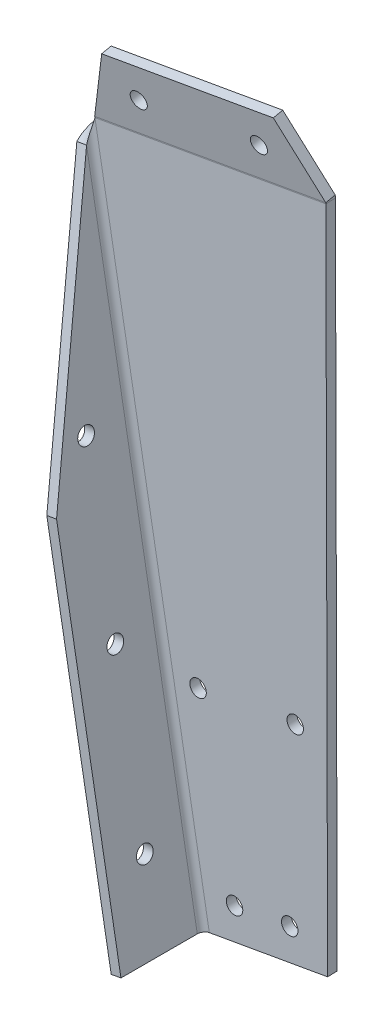
ISO-10303-21;
HEADER;
FILE_DESCRIPTION(('STEP AP214'),'2;1');
FILE_NAME('part.step','',(''),(''),'','','');
FILE_SCHEMA(('AUTOMOTIVE_DESIGN { 1 0 10303 214 1 1 1 1 }'));
ENDSEC;
DATA;
#1=APPLICATION_CONTEXT('core data for automotive mechanical design processes');
#2=APPLICATION_PROTOCOL_DEFINITION('international standard','automotive_design',2000,#1);
#3=PRODUCT_CONTEXT('',#1,'mechanical');
#4=PRODUCT('Part','Part','',(#3));
#5=PRODUCT_RELATED_PRODUCT_CATEGORY('part','',(#4));
#6=PRODUCT_DEFINITION_FORMATION('','',#4);
#7=PRODUCT_DEFINITION_CONTEXT('part definition',#1,'design');
#8=PRODUCT_DEFINITION('design','',#6,#7);
#9=PRODUCT_DEFINITION_SHAPE('','',#8);
#10=(LENGTH_UNIT() NAMED_UNIT(*) SI_UNIT(.MILLI.,.METRE.));
#11=(NAMED_UNIT(*) PLANE_ANGLE_UNIT() SI_UNIT($,.RADIAN.));
#12=(NAMED_UNIT(*) SI_UNIT($,.STERADIAN.) SOLID_ANGLE_UNIT());
#13=UNCERTAINTY_MEASURE_WITH_UNIT(LENGTH_MEASURE(1.E-05),#10,'distance_accuracy_value','');
#14=(GEOMETRIC_REPRESENTATION_CONTEXT(3) GLOBAL_UNCERTAINTY_ASSIGNED_CONTEXT((#13)) GLOBAL_UNIT_ASSIGNED_CONTEXT((#10,
#11,#12)) REPRESENTATION_CONTEXT('',''));
#15=CARTESIAN_POINT('',(0.,0.,0.));
#16=DIRECTION('',(0.,0.,1.));
#17=DIRECTION('',(1.,0.,0.));
#18=AXIS2_PLACEMENT_3D('',#15,#16,#17);
#19=CARTESIAN_POINT('',(40.5229081352837,-118.887426694435,-1.20000000000042));
#20=DIRECTION('',(-0.173648177666925,0.984807753012209,0.));
#21=DIRECTION('',(0.0301395647770479,0.00531441845699562,0.9995315720834));
#22=AXIS2_PLACEMENT_3D('',#19,#20,#21);
#23=PLANE('',#22);
#24=DIRECTION('',(-0.984807753012209,-0.173648177666925,0.));
#25=VECTOR('',#24,1.);
#26=CARTESIAN_POINT('',(40.5229081352837,-118.887426694435,-1.20000000000042));
#27=LINE('',#26,#25);
#28=CARTESIAN_POINT('',(56.058127365598,-116.14814839291,-1.20000000000058));
#29=VERTEX_POINT('',#28);
#30=CARTESIAN_POINT('',(41.7407214026586,-118.672693357932,-1.20000000000046));
#31=VERTEX_POINT('',#30);
#32=EDGE_CURVE('E851',#29,#31,#27,.T.);
#33=ORIENTED_EDGE('',*,*,#32,.F.);
#34=DIRECTION('',(0.0301395647770479,0.00531441845699562,0.9995315720834));
#35=VECTOR('',#34,1.);
#36=CARTESIAN_POINT('',(56.0435765136531,-116.1507141007,-1.6825562687206));
#37=LINE('',#36,#35);
#38=CARTESIAN_POINT('',(56.0943117931264,-116.141768102055,-5.34294830600857E-13));
#39=VERTEX_POINT('',#38);
#40=EDGE_CURVE('E857',#29,#39,#37,.T.);
#41=ORIENTED_EDGE('',*,*,#40,.T.);
#42=DIRECTION('',(-0.984807753012209,-0.173648177666925,0.));
#43=VECTOR('',#42,1.);
#44=CARTESIAN_POINT('',(40.5229081352837,-118.887426694435,-4.23272528138341E-13));
#45=LINE('',#44,#43);
#46=CARTESIAN_POINT('',(41.7407214026586,-118.672693357932,-4.57966997657877E-13));
#47=VERTEX_POINT('',#46);
#48=EDGE_CURVE('E381',#39,#47,#45,.T.);
#49=ORIENTED_EDGE('',*,*,#48,.T.);
#50=DIRECTION('',(0.,0.,-1.));
#51=VECTOR('',#50,1.);
#52=CARTESIAN_POINT('',(41.7407214026586,-118.672693357932,-4.57966997657877E-13));
#53=LINE('',#52,#51);
#54=EDGE_CURVE('E762',#47,#31,#53,.T.);
#55=ORIENTED_EDGE('',*,*,#54,.T.);
#56=EDGE_LOOP('',(#33,#41,#49,#55));
#57=FACE_BOUND('',#56,.T.);
#58=ADVANCED_FACE('F357',(#57),#23,.F.);
#59=CARTESIAN_POINT('',(51.4990755268782,-113.115970141008,7.5709961234934));
#60=DIRECTION('',(0.,0.,-1.));
#61=DIRECTION('',(-0.00259920917379773,0.99999662205013,0.));
#62=AXIS2_PLACEMENT_3D('',#59,#60,#61);
#63=CYLINDRICAL_SURFACE('',#62,1.);
#64=CARTESIAN_POINT('',(51.4990755268782,-113.115970141008,-4.75314232417645E-13));
#65=DIRECTION('',(0.,0.,1.));
#66=DIRECTION('',(0.00259920917379741,-0.99999662205013,0.));
#67=AXIS2_PLACEMENT_3D('',#64,#65,#66);
#68=CIRCLE('',#67,1.);
#69=CARTESIAN_POINT('',(51.501674736052,-114.115966763058,-4.82225370745937E-13));
#70=VERTEX_POINT('',#69);
#71=EDGE_CURVE('E856',#70,#70,#68,.T.);
#72=ORIENTED_EDGE('',*,*,#71,.T.);
#73=EDGE_LOOP('',(#72));
#74=FACE_BOUND('',#73,.T.);
#75=CARTESIAN_POINT('',(51.4990755268782,-113.115970141008,-1.20000000000047));
#76=DIRECTION('',(0.,0.,1.));
#77=DIRECTION('',(0.00259920917379741,-0.99999662205013,0.));
#78=AXIS2_PLACEMENT_3D('',#75,#76,#77);
#79=CIRCLE('',#78,1.);
#80=CARTESIAN_POINT('',(51.5016747360519,-114.115966763058,-1.20000000000048));
#81=VERTEX_POINT('',#80);
#82=EDGE_CURVE('E1230',#81,#81,#79,.T.);
#83=ORIENTED_EDGE('',*,*,#82,.F.);
#84=EDGE_LOOP('',(#83));
#85=FACE_BOUND('',#84,.T.);
#86=ADVANCED_FACE('F898',(#74,#85),#63,.F.);
#87=CARTESIAN_POINT('',(44.8019622447787,-114.296851905503,7.57099612349343));
#88=DIRECTION('',(0.,0.,-1.));
#89=DIRECTION('',(-0.00259920917379773,0.99999662205013,0.));
#90=AXIS2_PLACEMENT_3D('',#87,#88,#89);
#91=CYLINDRICAL_SURFACE('',#90,0.999999999999999);
#92=CARTESIAN_POINT('',(44.8019622447787,-114.296851905503,-4.31946145518225E-13));
#93=DIRECTION('',(0.,0.,1.));
#94=DIRECTION('',(0.00259920917379741,-0.99999662205013,0.));
#95=AXIS2_PLACEMENT_3D('',#92,#93,#94);
#96=CIRCLE('',#95,0.999999999999999);
#97=CARTESIAN_POINT('',(44.8045614539525,-115.296848527553,-4.38857283846517E-13));
#98=VERTEX_POINT('',#97);
#99=EDGE_CURVE('E860',#98,#98,#96,.T.);
#100=ORIENTED_EDGE('',*,*,#99,.T.);
#101=EDGE_LOOP('',(#100));
#102=FACE_BOUND('',#101,.T.);
#103=CARTESIAN_POINT('',(44.8019622447787,-114.296851905503,-1.20000000000042));
#104=DIRECTION('',(0.,0.,1.));
#105=DIRECTION('',(0.00259920917379741,-0.99999662205013,0.));
#106=AXIS2_PLACEMENT_3D('',#103,#104,#105);
#107=CIRCLE('',#106,0.999999999999999);
#108=CARTESIAN_POINT('',(44.8045614539525,-115.296848527553,-1.20000000000043));
#109=VERTEX_POINT('',#108);
#110=EDGE_CURVE('E1232',#109,#109,#107,.T.);
#111=ORIENTED_EDGE('',*,*,#110,.F.);
#112=EDGE_LOOP('',(#111));
#113=FACE_BOUND('',#112,.T.);
#114=ADVANCED_FACE('F894',(#102,#113),#91,.F.);
#115=CARTESIAN_POINT('',(52.1655284743713,-91.5762731472136,-19.7885837374025));
#116=DIRECTION('',(0.,0.,1.));
#117=DIRECTION('',(0.00259920917379774,-0.99999662205013,0.));
#118=AXIS2_PLACEMENT_3D('',#115,#116,#117);
#119=CYLINDRICAL_SURFACE('',#118,0.999999999999999);
#120=CARTESIAN_POINT('',(52.1655284743715,-91.5762731472136,-3.3133218391157E-13));
#121=DIRECTION('',(0.,0.,1.));
#122=DIRECTION('',(0.00259920917379741,-0.99999662205013,0.));
#123=AXIS2_PLACEMENT_3D('',#120,#121,#122);
#124=CIRCLE('',#123,0.999999999999999);
#125=CARTESIAN_POINT('',(52.1681276835453,-92.5762697692637,-3.38243322239862E-13));
#126=VERTEX_POINT('',#125);
#127=EDGE_CURVE('E1222',#126,#126,#124,.T.);
#128=ORIENTED_EDGE('',*,*,#127,.T.);
#129=EDGE_LOOP('',(#128));
#130=FACE_BOUND('',#129,.T.);
#131=CARTESIAN_POINT('',(52.1655284743714,-91.5762731472136,-1.20000000000033));
#132=DIRECTION('',(0.,0.,1.));
#133=DIRECTION('',(0.00259920917379741,-0.99999662205013,0.));
#134=AXIS2_PLACEMENT_3D('',#131,#132,#133);
#135=CIRCLE('',#134,0.999999999999999);
#136=CARTESIAN_POINT('',(52.1681276835452,-92.5762697692637,-1.20000000000033));
#137=VERTEX_POINT('',#136);
#138=EDGE_CURVE('E1235',#137,#137,#135,.T.);
#139=ORIENTED_EDGE('',*,*,#138,.F.);
#140=EDGE_LOOP('',(#139));
#141=FACE_BOUND('',#140,.T.);
#142=ADVANCED_FACE('F890',(#130,#141),#119,.F.);
#143=CARTESIAN_POINT('',(40.3757302963078,-93.6551326631136,-19.7885837374025));
#144=DIRECTION('',(0.,0.,1.));
#145=DIRECTION('',(0.00259920917379774,-0.99999662205013,0.));
#146=AXIS2_PLACEMENT_3D('',#143,#144,#145);
#147=CYLINDRICAL_SURFACE('',#146,1.00000000000001);
#148=CARTESIAN_POINT('',(40.3757302963079,-93.6551326631135,-2.48065457064683E-13));
#149=DIRECTION('',(0.,0.,1.));
#150=DIRECTION('',(0.00259920917379741,-0.99999662205013,0.));
#151=AXIS2_PLACEMENT_3D('',#148,#149,#150);
#152=CIRCLE('',#151,1.00000000000001);
#153=CARTESIAN_POINT('',(40.3783295054817,-94.6551292851637,-2.54976595392975E-13));
#154=VERTEX_POINT('',#153);
#155=EDGE_CURVE('E1218',#154,#154,#152,.T.);
#156=ORIENTED_EDGE('',*,*,#155,.T.);
#157=EDGE_LOOP('',(#156));
#158=FACE_BOUND('',#157,.T.);
#159=CARTESIAN_POINT('',(40.3757302963079,-93.6551326631135,-1.20000000000025));
#160=DIRECTION('',(0.,0.,1.));
#161=DIRECTION('',(0.00259920917379741,-0.99999662205013,0.));
#162=AXIS2_PLACEMENT_3D('',#159,#160,#161);
#163=CIRCLE('',#162,1.00000000000001);
#164=CARTESIAN_POINT('',(40.3783295054817,-94.6551292851637,-1.20000000000025));
#165=VERTEX_POINT('',#164);
#166=EDGE_CURVE('E1240',#165,#165,#163,.T.);
#167=ORIENTED_EDGE('',*,*,#166,.F.);
#168=EDGE_LOOP('',(#167));
#169=FACE_BOUND('',#168,.T.);
#170=ADVANCED_FACE('F886',(#158,#169),#147,.F.);
#171=CARTESIAN_POINT('',(26.7600931125057,-5.01209025732177,-1.19999999999953));
#172=DIRECTION('',(0.,0.,1.));
#173=DIRECTION('',(0.00259920917379741,-0.99999662205013,0.));
#174=AXIS2_PLACEMENT_3D('',#171,#172,#173);
#175=PLANE('',#174);
#176=ORIENTED_EDGE('',*,*,#166,.T.);
#177=EDGE_LOOP('',(#176));
#178=FACE_BOUND('',#177,.T.);
#179=ORIENTED_EDGE('',*,*,#138,.T.);
#180=EDGE_LOOP('',(#179));
#181=FACE_BOUND('',#180,.T.);
#182=ORIENTED_EDGE('',*,*,#110,.T.);
#183=EDGE_LOOP('',(#182));
#184=FACE_BOUND('',#183,.T.);
#185=ORIENTED_EDGE('',*,*,#82,.T.);
#186=EDGE_LOOP('',(#185));
#187=FACE_BOUND('',#186,.T.);
#188=DIRECTION('',(-0.984807753012209,-0.173648177666924,0.));
#189=VECTOR('',#188,1.);
#190=CARTESIAN_POINT('',(26.6422445310609,-40.1662715515746,-1.19999999999989));
#191=LINE('',#190,#189);
#192=CARTESIAN_POINT('',(55.8472488957681,-35.0166413103685,-1.20000000000009));
#193=VERTEX_POINT('',#192);
#194=CARTESIAN_POINT('',(27.8600577984359,-39.9515382150718,-1.1999999999998));
#195=VERTEX_POINT('',#194);
#196=EDGE_CURVE('E848',#193,#195,#191,.T.);
#197=ORIENTED_EDGE('',*,*,#196,.F.);
#198=DIRECTION('',(0.00259920917379741,-0.99999662205013,0.));
#199=VECTOR('',#198,1.);
#200=CARTESIAN_POINT('',(55.769064545279,-4.9366896179517,-1.19999999999977));
#201=LINE('',#200,#199);
#202=EDGE_CURVE('E852',#193,#29,#201,.T.);
#203=ORIENTED_EDGE('',*,*,#202,.T.);
#204=ORIENTED_EDGE('',*,*,#32,.T.);
#205=DIRECTION('',(-0.173648177666924,0.984807753012209,0.));
#206=VECTOR('',#205,1.);
#207=CARTESIAN_POINT('',(41.7407214026586,-118.672693357932,-1.20000000000046));
#208=LINE('',#207,#206);
#209=EDGE_CURVE('E754',#31,#195,#208,.T.);
#210=ORIENTED_EDGE('',*,*,#209,.T.);
#211=EDGE_LOOP('',(#197,#203,#204,#210));
#212=FACE_BOUND('',#211,.T.);
#213=ADVANCED_FACE('F845',(#178,#181,#184,#187,#212),#175,.F.);
#214=CARTESIAN_POINT('',(48.0948388677279,9.29093557071434,-254.361269440302));
#215=DIRECTION('',(-0.999541897699897,-0.00259802724610245,0.0301536896070483));
#216=DIRECTION('',(0.0301536896070484,-0.171010071662835,0.984807753012208));
#217=AXIS2_PLACEMENT_3D('',#214,#215,#216);
#218=PLANE('',#217);
#219=CARTESIAN_POINT('',(55.8834333232966,-35.0102610195137,0.));
#220=CARTESIAN_POINT('',(55.8472488957681,-35.0166413103684,-1.20000000000009));
#221=B_SPLINE_CURVE_WITH_KNOTS('',1,(#219,#220),.UNSPECIFIED.,.F.,.F.,(2,2),(0.,1.),.UNSPECIFIED.);
#222=CARTESIAN_POINT('',(55.8834333232966,-35.0102610195137,0.));
#223=VERTEX_POINT('',#222);
#224=EDGE_CURVE('E763',#223,#193,#221,.T.);
#225=ORIENTED_EDGE('',*,*,#224,.F.);
#226=DIRECTION('',(0.00259920917379741,-0.99999662205013,0.));
#227=VECTOR('',#226,1.);
#228=CARTESIAN_POINT('',(55.805265312004,-4.9365955242689,2.31585584042904E-13));
#229=LINE('',#228,#227);
#230=EDGE_CURVE('E853',#223,#39,#229,.T.);
#231=ORIENTED_EDGE('',*,*,#230,.T.);
#232=ORIENTED_EDGE('',*,*,#40,.F.);
#233=ORIENTED_EDGE('',*,*,#202,.F.);
#234=EDGE_LOOP('',(#225,#231,#232,#233));
#235=FACE_BOUND('',#234,.T.);
#236=ADVANCED_FACE('F875',(#235),#218,.F.);
#237=CARTESIAN_POINT('',(26.7600931125058,-5.01209025732178,4.70110061989715E-13));
#238=DIRECTION('',(0.,0.,1.));
#239=DIRECTION('',(0.00259920917379741,-0.99999662205013,0.));
#240=AXIS2_PLACEMENT_3D('',#237,#238,#239);
#241=PLANE('',#240);
#242=ORIENTED_EDGE('',*,*,#155,.F.);
#243=EDGE_LOOP('',(#242));
#244=FACE_BOUND('',#243,.T.);
#245=ORIENTED_EDGE('',*,*,#127,.F.);
#246=EDGE_LOOP('',(#245));
#247=FACE_BOUND('',#246,.T.);
#248=ORIENTED_EDGE('',*,*,#99,.F.);
#249=EDGE_LOOP('',(#248));
#250=FACE_BOUND('',#249,.T.);
#251=ORIENTED_EDGE('',*,*,#71,.F.);
#252=EDGE_LOOP('',(#251));
#253=FACE_BOUND('',#252,.T.);
#254=ORIENTED_EDGE('',*,*,#230,.F.);
#255=DIRECTION('',(0.984807753012209,0.173648177666924,0.));
#256=VECTOR('',#255,1.);
#257=CARTESIAN_POINT('',(26.6422445310609,-40.1662715515746,1.14406405250876E-13));
#258=LINE('',#257,#256);
#259=CARTESIAN_POINT('',(27.8600577984359,-39.9515382150717,0.));
#260=VERTEX_POINT('',#259);
#261=EDGE_CURVE('E373',#260,#223,#258,.T.);
#262=ORIENTED_EDGE('',*,*,#261,.F.);
#263=DIRECTION('',(-0.173648177666924,0.984807753012209,0.));
#264=VECTOR('',#263,1.);
#265=CARTESIAN_POINT('',(41.7407214026586,-118.672693357932,-4.57966997657877E-13));
#266=LINE('',#265,#264);
#267=EDGE_CURVE('E366',#47,#260,#266,.T.);
#268=ORIENTED_EDGE('',*,*,#267,.F.);
#269=ORIENTED_EDGE('',*,*,#48,.F.);
#270=EDGE_LOOP('',(#254,#262,#268,#269));
#271=FACE_BOUND('',#270,.T.);
#272=ADVANCED_FACE('F359',(#244,#247,#250,#253,#271),#241,.T.);
#273=CARTESIAN_POINT('',(27.8600577984359,-39.9515382150717,0.736600000000106));
#274=DIRECTION('',(-0.984807753012209,-0.173648177666925,0.));
#275=DIRECTION('',(0.173648177666925,-0.984807753012209,0.));
#276=AXIS2_PLACEMENT_3D('',#273,#274,#275);
#277=PLANE('',#276);
#278=CARTESIAN_POINT('',(27.8600577984359,-39.9515382150718,1.95373231481888E-13));
#279=CARTESIAN_POINT('',(27.8600577984359,-39.9515382150718,-1.1999999999998));
#280=B_SPLINE_CURVE_WITH_KNOTS('',1,(#278,#279),.UNSPECIFIED.,.F.,.F.,(2,2),(0.,1.),.UNSPECIFIED.);
#281=EDGE_CURVE('E13',#260,#195,#280,.T.);
#282=ORIENTED_EDGE('',*,*,#281,.F.);
#283=CARTESIAN_POINT('',(27.8600577984359,-39.9515382150717,0.736600000000106));
#284=DIRECTION('',(0.984807753012209,0.173648177666924,0.));
#285=DIRECTION('',(-0.173648177666924,0.984807753012209,0.));
#286=AXIS2_PLACEMENT_3D('',#283,#284,#285);
#287=CIRCLE('',#286,0.7366);
#288=CARTESIAN_POINT('',(27.8378465906713,-39.8255721962848,0.0111906091312111));
#289=VERTEX_POINT('',#288);
#290=EDGE_CURVE('E1169',#260,#289,#287,.T.);
#291=ORIENTED_EDGE('',*,*,#290,.T.);
#292=DIRECTION('',(0.0301536896070447,-0.171010071662835,0.984807753012208));
#293=VECTOR('',#292,1.);
#294=CARTESIAN_POINT('',(27.0236969712811,-35.2083002613882,-26.5786187221984));
#295=LINE('',#294,#293);
#296=CARTESIAN_POINT('',(27.8016621631428,-39.6203601102894,-1.17057869448333));
#297=VERTEX_POINT('',#296);
#298=EDGE_CURVE('E654',#297,#289,#295,.T.);
#299=ORIENTED_EDGE('',*,*,#298,.F.);
#300=CARTESIAN_POINT('',(27.8600577984359,-39.9515382150717,0.736600000000106));
#301=DIRECTION('',(0.984807753012209,0.173648177666925,0.));
#302=DIRECTION('',(0.173648177666925,-0.984807753012209,0.));
#303=AXIS2_PLACEMENT_3D('',#300,#301,#302);
#304=CIRCLE('',#303,1.9366);
#305=EDGE_CURVE('E862',#195,#297,#304,.T.);
#306=ORIENTED_EDGE('',*,*,#305,.F.);
#307=EDGE_LOOP('',(#282,#291,#299,#306));
#308=FACE_BOUND('',#307,.T.);
#309=ADVANCED_FACE('F744',(#308),#277,.T.);
#310=CARTESIAN_POINT('',(13.7253387913835,-42.4438705407477,0.736600000000204));
#311=DIRECTION('',(0.984807753012209,0.173648177666924,0.));
#312=DIRECTION('',(-0.173648177666924,0.984807753012209,0.));
#313=AXIS2_PLACEMENT_3D('',#310,#311,#312);
#314=CYLINDRICAL_SURFACE('',#313,1.9366);
#315=CARTESIAN_POINT('',(55.8472488957681,-35.0166413103684,-1.20000000000009));
#316=CARTESIAN_POINT('',(55.8472241016725,-34.9880444601742,-1.20000000000009));
#317=CARTESIAN_POINT('',(55.8471745137314,-34.9308508101799,-1.19877082200849));
#318=CARTESIAN_POINT('',(55.8471280631713,-34.845218574945,-1.19324291326373));
#319=CARTESIAN_POINT('',(55.8471374219261,-34.7599029037991,-1.18404146852308));
#320=CARTESIAN_POINT('',(55.8471993831093,-34.7033419151785,-1.17546979151803));
#321=CARTESIAN_POINT('',(55.8472488957679,-34.6751664795284,-1.17057869448351));
#322=B_SPLINE_CURVE_WITH_KNOTS('',3,(#315,#316,#317,#318,#319,#320,#321),.UNSPECIFIED.,.F.,.F.,
(4,1,1,1,4),(0.,0.25,0.5,0.75,1.),.UNSPECIFIED.);
#323=CARTESIAN_POINT('',(55.8472488957681,-34.6751664795284,-1.17057869448352));
#324=VERTEX_POINT('',#323);
#325=EDGE_CURVE('E642',#324,#193,#322,.F.);
#326=ORIENTED_EDGE('',*,*,#325,.T.);
#327=ORIENTED_EDGE('',*,*,#196,.T.);
#328=ORIENTED_EDGE('',*,*,#305,.T.);
#329=CARTESIAN_POINT('',(27.8016621631428,-39.6203601102895,-1.17057869448333));
#330=DIRECTION('',(0.984807753012209,0.173648177666926,0.));
#331=VECTOR('',#330,1.);
#332=LINE('',#329,#331);
#333=EDGE_CURVE('E589',#297,#324,#332,.T.);
#334=ORIENTED_EDGE('',*,*,#333,.T.);
#335=EDGE_LOOP('',(#326,#327,#328,#334));
#336=FACE_BOUND('',#335,.T.);
#337=ADVANCED_FACE('F694',(#336),#314,.T.);
#338=CARTESIAN_POINT('',(13.7253387913835,-42.4438705407477,0.736600000000204));
#339=DIRECTION('',(0.984807753012209,0.173648177666924,0.));
#340=DIRECTION('',(-0.173648177666924,0.984807753012209,0.));
#341=AXIS2_PLACEMENT_3D('',#338,#339,#340);
#342=CYLINDRICAL_SURFACE('',#341,0.7366);
#343=CARTESIAN_POINT('',(55.8834333232966,-34.8803785655238,0.0111906091311233));
#344=CARTESIAN_POINT('',(55.8834144908166,-34.8910952861001,0.00933024676153595));
#345=CARTESIAN_POINT('',(55.8833909420029,-34.9126088158643,0.00607100832402899));
#346=CARTESIAN_POINT('',(55.8833873943961,-34.9450592998507,0.00257212612294775));
#347=CARTESIAN_POINT('',(55.883405045376,-34.9776300277161,0.000468597004172474));
#348=CARTESIAN_POINT('',(55.8834238926919,-34.9993840110196,0.));
#349=CARTESIAN_POINT('',(55.8834333232966,-35.0102610195137,0.));
#350=B_SPLINE_CURVE_WITH_KNOTS('',3,(#343,#344,#345,#346,#347,#348,#349),.UNSPECIFIED.,.F.,.F.,
(4,1,1,1,4),(0.,0.25,0.5,0.75,1.),.UNSPECIFIED.);
#351=CARTESIAN_POINT('',(55.8834333232964,-34.8803785655238,0.0111906091312076));
#352=VERTEX_POINT('',#351);
#353=EDGE_CURVE('E731',#352,#223,#350,.T.);
#354=ORIENTED_EDGE('',*,*,#353,.F.);
#355=CARTESIAN_POINT('',(27.8378465906713,-39.8255721962849,0.0111906091311807));
#356=DIRECTION('',(0.984807753012209,0.173648177666925,0.));
#357=VECTOR('',#356,1.);
#358=LINE('',#355,#357);
#359=EDGE_CURVE('E672',#289,#352,#358,.T.);
#360=ORIENTED_EDGE('',*,*,#359,.F.);
#361=ORIENTED_EDGE('',*,*,#290,.F.);
#362=ORIENTED_EDGE('',*,*,#261,.T.);
#363=EDGE_LOOP('',(#354,#360,#361,#362));
#364=FACE_BOUND('',#363,.T.);
#365=ADVANCED_FACE('F693',(#364),#342,.F.);
#366=CARTESIAN_POINT('',(55.8472488957679,-34.6751664795284,-1.17057869448351));
#367=CARTESIAN_POINT('',(55.8834333232966,-34.8803785655238,0.0111906091311233));
#368=CARTESIAN_POINT('',(55.8471993831093,-34.7033419151785,-1.17546979151803));
#369=CARTESIAN_POINT('',(55.8834144908166,-34.8910952861001,0.00933024676153595));
#370=CARTESIAN_POINT('',(55.8471374219261,-34.7599029037991,-1.18404146852308));
#371=CARTESIAN_POINT('',(55.8833909420029,-34.9126088158643,0.00607100832402899));
#372=CARTESIAN_POINT('',(55.8471280631713,-34.845218574945,-1.19324291326373));
#373=CARTESIAN_POINT('',(55.8833873943961,-34.9450592998507,0.00257212612294775));
#374=CARTESIAN_POINT('',(55.8471745137314,-34.9308508101799,-1.19877082200849));
#375=CARTESIAN_POINT('',(55.883405045376,-34.9776300277161,0.000468597004172474));
#376=CARTESIAN_POINT('',(55.8472241016725,-34.9880444601742,-1.20000000000009));
#377=CARTESIAN_POINT('',(55.8834238926919,-34.9993840110196,0.));
#378=CARTESIAN_POINT('',(55.8472488957681,-35.0166413103684,-1.20000000000009));
#379=CARTESIAN_POINT('',(55.8834333232966,-35.0102610195137,0.));
#380=B_SPLINE_SURFACE_WITH_KNOTS('',3,1,((#366,#367),(#368,#369),(#370,#371),(#372,#373),(#374,
#375),(#376,#377),(#378,#379)),.UNSPECIFIED.,.F.,.F.,.F.,(4,1,1,1,4),(2,2),(0.,0.25,0.5,0.75,
1.),(0.,1.),.UNSPECIFIED.);
#381=CARTESIAN_POINT('',(55.8472488957679,-34.6751664795284,-1.17057869448351));
#382=CARTESIAN_POINT('',(55.8834333232966,-34.8803785655238,0.0111906091311233));
#383=B_SPLINE_CURVE_WITH_KNOTS('',1,(#381,#382),.UNSPECIFIED.,.F.,.F.,(2,2),(0.,1.),.UNSPECIFIED.);
#384=EDGE_CURVE('E495',#324,#352,#383,.T.);
#385=ORIENTED_EDGE('',*,*,#325,.F.);
#386=ORIENTED_EDGE('',*,*,#384,.T.);
#387=ORIENTED_EDGE('',*,*,#353,.T.);
#388=ORIENTED_EDGE('',*,*,#224,.T.);
#389=EDGE_LOOP('',(#385,#386,#387,#388));
#390=FACE_BOUND('',#389,.T.);
#391=ADVANCED_FACE('F682',(#390),#380,.F.);
#392=CARTESIAN_POINT('',(50.090388551939,-23.1410201800376,-25.189433300863));
#393=DIRECTION('',(0.171010071662827,-0.969846310392955,-0.173648177666931));
#394=DIRECTION('',(0.98480775301221,0.173648177666923,0.));
#395=AXIS2_PLACEMENT_3D('',#392,#393,#394);
#396=PLANE('',#395);
#397=DIRECTION('',(-0.984807753012209,-0.173648177666924,0.));
#398=VECTOR('',#397,1.);
#399=CARTESIAN_POINT('',(31.3417823967429,-30.9961413981538,0.218606726851967));
#400=LINE('',#399,#398);
#401=CARTESIAN_POINT('',(50.8683537438007,-27.5530800289388,0.218606726851904));
#402=VERTEX_POINT('',#401);
#403=CARTESIAN_POINT('',(30.0443961685048,-31.2249055945917,0.218606726851984));
#404=VERTEX_POINT('',#403);
#405=EDGE_CURVE('E670',#402,#404,#400,.T.);
#406=ORIENTED_EDGE('',*,*,#405,.T.);
#407=DIRECTION('',(0.0301536896070447,-0.171010071662835,0.984807753012208));
#408=VECTOR('',#407,1.);
#409=CARTESIAN_POINT('',(29.2664309766431,-26.8128457456906,-25.189433300863));
#410=LINE('',#409,#408);
#411=CARTESIAN_POINT('',(30.0805805960333,-31.4301176805871,1.40037603046665));
#412=VERTEX_POINT('',#411);
#413=EDGE_CURVE('E668',#404,#412,#410,.T.);
#414=ORIENTED_EDGE('',*,*,#413,.T.);
#415=DIRECTION('',(0.984807753012209,0.173648177666923,0.));
#416=VECTOR('',#415,1.);
#417=CARTESIAN_POINT('',(50.9045381713292,-27.7582921149342,1.40037603046665));
#418=LINE('',#417,#416);
#419=CARTESIAN_POINT('',(50.9045381713292,-27.7582921149342,1.40037603046665));
#420=VERTEX_POINT('',#419);
#421=EDGE_CURVE('E665',#412,#420,#418,.T.);
#422=ORIENTED_EDGE('',*,*,#421,.T.);
#423=DIRECTION('',(0.0301536896070447,-0.171010071662835,0.984807753012208));
#424=VECTOR('',#423,1.);
#425=CARTESIAN_POINT('',(50.090388551939,-23.1410201800376,-25.189433300863));
#426=LINE('',#425,#424);
#427=EDGE_CURVE('E643',#402,#420,#426,.T.);
#428=ORIENTED_EDGE('',*,*,#427,.F.);
#429=EDGE_LOOP('',(#406,#414,#422,#428));
#430=FACE_BOUND('',#429,.T.);
#431=ADVANCED_FACE('F608',(#430),#396,.F.);
#432=CARTESIAN_POINT('',(25.9625280223995,-0.488873861839912,5.68084477066329));
#433=DIRECTION('',(-0.0301536896070516,0.171010071662835,-0.984807753012208));
#434=DIRECTION('',(-0.999541897699897,-0.00259802724610162,0.0301536896070517));
#435=AXIS2_PLACEMENT_3D('',#432,#433,#434);
#436=PLANE('',#435);
#437=CARTESIAN_POINT('',(33.8470679308848,-34.5543919641059,-0.475985983815774));
#438=DIRECTION('',(-0.0301536896070516,0.171010071662835,-0.984807753012208));
#439=DIRECTION('',(0.,0.985255774317392,0.171087869746036));
#440=AXIS2_PLACEMENT_3D('',#437,#438,#439);
#441=CIRCLE('',#440,1.);
#442=CARTESIAN_POINT('',(33.8470679308848,-33.5691361897885,-0.304898114069738));
#443=VERTEX_POINT('',#442);
#444=EDGE_CURVE('E779',#443,#443,#441,.T.);
#445=ORIENTED_EDGE('',*,*,#444,.F.);
#446=EDGE_LOOP('',(#445));
#447=FACE_BOUND('',#446,.T.);
#448=CARTESIAN_POINT('',(48.4337625547233,-31.9823641425682,-0.475985983815875));
#449=DIRECTION('',(-0.0301536896070516,0.171010071662835,-0.984807753012208));
#450=DIRECTION('',(0.,0.985255774317392,0.171087869746036));
#451=AXIS2_PLACEMENT_3D('',#448,#449,#450);
#452=CIRCLE('',#451,0.999999999999991);
#453=CARTESIAN_POINT('',(48.4337625547233,-30.9971083682508,-0.304898114069841));
#454=VERTEX_POINT('',#453);
#455=EDGE_CURVE('E771',#454,#454,#452,.T.);
#456=ORIENTED_EDGE('',*,*,#455,.F.);
#457=EDGE_LOOP('',(#456));
#458=FACE_BOUND('',#457,.T.);
#459=DIRECTION('',(-0.565771308250691,0.809310508784769,0.157858566859199));
#460=VECTOR('',#459,1.);
#461=CARTESIAN_POINT('',(30.0159417764573,2.27536106125985,6.03673822401128));
#462=LINE('',#461,#460);
#463=EDGE_CURVE('E647',#324,#402,#462,.T.);
#464=ORIENTED_EDGE('',*,*,#463,.F.);
#465=ORIENTED_EDGE('',*,*,#333,.F.);
#466=DIRECTION('',(-0.254850627206041,-0.954008296966986,-0.157858566859194));
#467=VECTOR('',#466,1.);
#468=CARTESIAN_POINT('',(37.4718708282934,-3.42088357340357,4.81930368424763));
#469=LINE('',#468,#467);
#470=EDGE_CURVE('E659',#404,#297,#469,.T.);
#471=ORIENTED_EDGE('',*,*,#470,.F.);
#472=ORIENTED_EDGE('',*,*,#405,.F.);
#473=EDGE_LOOP('',(#464,#465,#471,#472));
#474=FACE_BOUND('',#473,.T.);
#475=ADVANCED_FACE('F597',(#447,#458,#474),#436,.T.);
#476=CARTESIAN_POINT('',(27.0236969712811,-35.2083002613882,-26.5786187221984));
#477=DIRECTION('',(0.966510172122244,-0.246218855305649,-0.0723488940911113));
#478=DIRECTION('',(0.254850627206042,0.954008296966986,0.157858566859195));
#479=AXIS2_PLACEMENT_3D('',#476,#477,#478);
#480=PLANE('',#479);
#481=ORIENTED_EDGE('',*,*,#470,.T.);
#482=ORIENTED_EDGE('',*,*,#298,.T.);
#483=DIRECTION('',(0.254850627206041,0.954008296966986,0.157858566859195));
#484=VECTOR('',#483,1.);
#485=CARTESIAN_POINT('',(27.8378465906713,-39.8255721962848,0.0111906091312111));
#486=LINE('',#485,#484);
#487=EDGE_CURVE('E649',#289,#412,#486,.T.);
#488=ORIENTED_EDGE('',*,*,#487,.T.);
#489=ORIENTED_EDGE('',*,*,#413,.F.);
#490=EDGE_LOOP('',(#481,#482,#488,#489));
#491=FACE_BOUND('',#490,.T.);
#492=ADVANCED_FACE('F607',(#491),#480,.F.);
#493=CARTESIAN_POINT('',(25.998712449928,-0.694085947835313,6.86261407427794));
#494=DIRECTION('',(-0.0301536896070516,0.171010071662835,-0.984807753012208));
#495=DIRECTION('',(-0.999541897699897,-0.00259802724610162,0.0301536896070517));
#496=AXIS2_PLACEMENT_3D('',#493,#494,#495);
#497=PLANE('',#496);
#498=CARTESIAN_POINT('',(33.8832523584133,-34.7596040501013,0.705783319798873));
#499=DIRECTION('',(-0.0301536896070516,0.171010071662835,-0.984807753012208));
#500=DIRECTION('',(0.,0.985255774317392,0.171087869746036));
#501=AXIS2_PLACEMENT_3D('',#498,#499,#500);
#502=CIRCLE('',#501,1.);
#503=CARTESIAN_POINT('',(33.8832523584133,-33.7743482757839,0.876871189544909));
#504=VERTEX_POINT('',#503);
#505=EDGE_CURVE('E361',#504,#504,#502,.T.);
#506=ORIENTED_EDGE('',*,*,#505,.T.);
#507=EDGE_LOOP('',(#506));
#508=FACE_BOUND('',#507,.T.);
#509=CARTESIAN_POINT('',(48.4699469822518,-32.1875762285636,0.705783319798772));
#510=DIRECTION('',(-0.0301536896070516,0.171010071662835,-0.984807753012208));
#511=DIRECTION('',(0.,0.985255774317392,0.171087869746036));
#512=AXIS2_PLACEMENT_3D('',#509,#510,#511);
#513=CIRCLE('',#512,0.999999999999991);
#514=CARTESIAN_POINT('',(48.4699469822518,-31.2023204542462,0.876871189544807));
#515=VERTEX_POINT('',#514);
#516=EDGE_CURVE('E489',#515,#515,#513,.T.);
#517=ORIENTED_EDGE('',*,*,#516,.T.);
#518=EDGE_LOOP('',(#517));
#519=FACE_BOUND('',#518,.T.);
#520=ORIENTED_EDGE('',*,*,#359,.T.);
#521=DIRECTION('',(0.565771308250691,-0.80931050878477,-0.157858566859195));
#522=VECTOR('',#521,1.);
#523=CARTESIAN_POINT('',(55.8834333232964,-34.8803785655238,0.0111906091312076));
#524=LINE('',#523,#522);
#525=EDGE_CURVE('E635',#420,#352,#524,.T.);
#526=ORIENTED_EDGE('',*,*,#525,.F.);
#527=ORIENTED_EDGE('',*,*,#421,.F.);
#528=ORIENTED_EDGE('',*,*,#487,.F.);
#529=EDGE_LOOP('',(#520,#526,#527,#528));
#530=FACE_BOUND('',#529,.T.);
#531=ADVANCED_FACE('F612',(#508,#519,#530),#497,.F.);
#532=CARTESIAN_POINT('',(55.0692837039062,-30.2631066306273,-26.5786187221984));
#533=DIRECTION('',(-0.82401066847668,-0.561935989024025,-0.072348894091111));
#534=DIRECTION('',(0.565771308250691,-0.80931050878477,-0.157858566859195));
#535=AXIS2_PLACEMENT_3D('',#532,#533,#534);
#536=PLANE('',#535);
#537=ORIENTED_EDGE('',*,*,#463,.T.);
#538=ORIENTED_EDGE('',*,*,#427,.T.);
#539=ORIENTED_EDGE('',*,*,#525,.T.);
#540=ORIENTED_EDGE('',*,*,#384,.F.);
#541=EDGE_LOOP('',(#537,#538,#539,#540));
#542=FACE_BOUND('',#541,.T.);
#543=ADVANCED_FACE('F617',(#542),#536,.F.);
#544=CARTESIAN_POINT('',(26.3997371705269,-42.8220833048548,0.736600000000174));
#545=CARTESIAN_POINT('',(26.3624950848802,-42.6108729416018,0.483073011947979));
#546=CARTESIAN_POINT('',(26.3748995826305,-42.3909543146371,0.22969904715));
#547=CARTESIAN_POINT('',(26.4914963927533,-41.9348866240483,-0.238708517386096));
#548=CARTESIAN_POINT('',(26.595617439431,-41.6987730107096,-0.45353117790323));
#549=CARTESIAN_POINT('',(26.8741982484077,-41.2141431706798,-0.812034806988121));
#550=CARTESIAN_POINT('',(27.0485190977932,-40.9656514380833,-0.955574719686661));
#551=CARTESIAN_POINT('',(27.4353341544888,-40.461936979944,-1.14959548563566));
#552=CARTESIAN_POINT('',(27.647624540651,-40.2067730777894,-1.1999999999998));
#553=CARTESIAN_POINT('',(27.8600577984359,-39.9515382150718,-1.1999999999998));
#554=CARTESIAN_POINT('',(27.5815064741416,-42.6137054916545,0.736600000000175));
#555=CARTESIAN_POINT('',(27.5442671728641,-42.4025109193445,0.640176361993732));
#556=CARTESIAN_POINT('',(27.5259105944765,-42.1880000181561,0.543796508381133));
#557=CARTESIAN_POINT('',(27.5241103244267,-41.7528089272388,0.36563425905898));
#558=CARTESIAN_POINT('',(27.5406391668956,-41.5321401828019,0.283924886066663));
#559=CARTESIAN_POINT('',(27.6004506977112,-41.086085269062,0.147565403889692));
#560=CARTESIAN_POINT('',(27.6436805495132,-40.8607084162675,0.0929689463384422));
#561=CARTESIAN_POINT('',(27.7446597695107,-40.4073945281914,0.019171726366314));
#562=CARTESIAN_POINT('',(27.802338353431,-40.1794765764056,1.93750525208653E-13));
#563=CARTESIAN_POINT('',(27.8600577984359,-39.9515382150718,1.95373231481888E-13));
#564=B_SPLINE_SURFACE_WITH_KNOTS('',1,3,((#544,#545,#546,#547,#548,#549,#550,#551,#552,#553),
(#554,#555,#556,#557,#558,#559,#560,#561,#562,#563)),.UNSPECIFIED.,.F.,.F.,.F.,(2,2),(4,2,2,2,
4),(0.,1.),(0.,0.25,0.5,0.75,1.),.UNSPECIFIED.);
#565=CARTESIAN_POINT('',(26.3997371705269,-42.8220833048548,0.736600000000174));
#566=CARTESIAN_POINT('',(27.5815064741416,-42.6137054916545,0.736600000000175));
#567=B_SPLINE_CURVE_WITH_KNOTS('',1,(#565,#566),.UNSPECIFIED.,.F.,.F.,(2,2),(0.,1.),.UNSPECIFIED.);
#568=CARTESIAN_POINT('',(27.5815064741415,-42.6137054916546,0.736600000000191));
#569=VERTEX_POINT('',#568);
#570=CARTESIAN_POINT('',(26.3997371705269,-42.8220833048549,0.73660000000018));
#571=VERTEX_POINT('',#570);
#572=EDGE_CURVE('E460',#569,#571,#567,.F.);
#573=CARTESIAN_POINT('',(27.5815064741416,-42.6137054916545,0.736600000000175));
#574=CARTESIAN_POINT('',(27.5442671728641,-42.4025109193445,0.640176361993732));
#575=CARTESIAN_POINT('',(27.5259105944765,-42.1880000181561,0.543796508381133));
#576=CARTESIAN_POINT('',(27.5241103244267,-41.7528089272388,0.36563425905898));
#577=CARTESIAN_POINT('',(27.5406391668956,-41.5321401828019,0.283924886066663));
#578=CARTESIAN_POINT('',(27.6004506977112,-41.086085269062,0.147565403889692));
#579=CARTESIAN_POINT('',(27.6436805495132,-40.8607084162675,0.0929689463384422));
#580=CARTESIAN_POINT('',(27.7446597695107,-40.4073945281914,0.019171726366314));
#581=CARTESIAN_POINT('',(27.802338353431,-40.1794765764056,1.93750525208653E-13));
#582=CARTESIAN_POINT('',(27.8600577984359,-39.9515382150718,1.95373231481888E-13));
#583=B_SPLINE_CURVE_WITH_KNOTS('',3,(#573,#574,#575,#576,#577,#578,#579,#580,#581,#582),
.UNSPECIFIED.,.F.,.F.,(4,2,2,2,4),(0.,0.25,0.5,0.75,1.),.UNSPECIFIED.);
#584=EDGE_CURVE('E500',#569,#260,#583,.T.);
#585=CARTESIAN_POINT('',(27.8600577984359,-39.9515382150718,-1.1999999999998));
#586=CARTESIAN_POINT('',(27.647624540651,-40.2067730777894,-1.1999999999998));
#587=CARTESIAN_POINT('',(27.4353341544888,-40.461936979944,-1.14959548563566));
#588=CARTESIAN_POINT('',(27.0485190977932,-40.9656514380833,-0.955574719686661));
#589=CARTESIAN_POINT('',(26.8741982484077,-41.2141431706798,-0.812034806988121));
#590=CARTESIAN_POINT('',(26.595617439431,-41.6987730107096,-0.45353117790323));
#591=CARTESIAN_POINT('',(26.4914963927533,-41.9348866240483,-0.238708517386096));
#592=CARTESIAN_POINT('',(26.3748995826305,-42.3909543146371,0.22969904715));
#593=CARTESIAN_POINT('',(26.3624950848802,-42.6108729416018,0.483073011947979));
#594=CARTESIAN_POINT('',(26.3997371705269,-42.8220833048548,0.736600000000174));
#595=B_SPLINE_CURVE_WITH_KNOTS('',3,(#585,#586,#587,#588,#589,#590,#591,#592,#593,#594),
.UNSPECIFIED.,.F.,.F.,(4,2,2,2,4),(0.,0.25,0.5,0.75,1.),.UNSPECIFIED.);
#596=EDGE_CURVE('E496',#571,#195,#595,.F.);
#597=ORIENTED_EDGE('',*,*,#572,.F.);
#598=ORIENTED_EDGE('',*,*,#584,.T.);
#599=ORIENTED_EDGE('',*,*,#281,.T.);
#600=ORIENTED_EDGE('',*,*,#596,.F.);
#601=EDGE_LOOP('',(#597,#598,#599,#600));
#602=FACE_BOUND('',#601,.T.);
#603=ADVANCED_FACE('F527',(#602),#564,.T.);
#604=CARTESIAN_POINT('',(41.7407214026586,-118.672693357932,0.736599999999537));
#605=DIRECTION('',(0.173648177666845,-0.984807753012223,0.));
#606=DIRECTION('',(0.984807753012223,0.173648177666845,0.));
#607=AXIS2_PLACEMENT_3D('',#604,#605,#606);
#608=PLANE('',#607);
#609=CARTESIAN_POINT('',(41.7407214026586,-118.672693357932,0.736599999999537));
#610=DIRECTION('',(-0.173648177666924,0.984807753012209,0.));
#611=DIRECTION('',(-0.984807753012209,-0.173648177666924,0.));
#612=AXIS2_PLACEMENT_3D('',#609,#610,#611);
#613=CIRCLE('',#612,0.7366);
#614=CARTESIAN_POINT('',(41.0153120117898,-118.800602605602,0.736599999999549));
#615=VERTEX_POINT('',#614);
#616=EDGE_CURVE('E497',#47,#615,#613,.T.);
#617=ORIENTED_EDGE('',*,*,#616,.T.);
#618=DIRECTION('',(-0.98480775301221,-0.173648177666925,0.));
#619=VECTOR('',#618,1.);
#620=CARTESIAN_POINT('',(41.0153120117898,-118.800602605602,0.736599999999563));
#621=LINE('',#620,#619);
#622=CARTESIAN_POINT('',(39.8335427081752,-119.008980418802,0.73659999999957));
#623=VERTEX_POINT('',#622);
#624=EDGE_CURVE('E456',#615,#623,#621,.T.);
#625=ORIENTED_EDGE('',*,*,#624,.T.);
#626=CARTESIAN_POINT('',(41.7407214026586,-118.672693357932,0.736599999999537));
#627=DIRECTION('',(-0.173648177666845,0.984807753012223,0.));
#628=DIRECTION('',(-0.984807753012223,-0.173648177666845,0.));
#629=AXIS2_PLACEMENT_3D('',#626,#627,#628);
#630=CIRCLE('',#629,1.9366);
#631=EDGE_CURVE('E492',#31,#623,#630,.T.);
#632=ORIENTED_EDGE('',*,*,#631,.F.);
#633=ORIENTED_EDGE('',*,*,#54,.F.);
#634=EDGE_LOOP('',(#617,#625,#632,#633));
#635=FACE_BOUND('',#634,.T.);
#636=ADVANCED_FACE('F518',(#635),#608,.T.);
#637=CARTESIAN_POINT('',(48.7963549799212,-158.687179790547,0.736599999999202));
#638=DIRECTION('',(-0.173648177666924,0.984807753012209,0.));
#639=DIRECTION('',(-0.984807753012209,-0.173648177666924,0.));
#640=AXIS2_PLACEMENT_3D('',#637,#638,#639);
#641=CYLINDRICAL_SURFACE('',#640,1.9366);
#642=ORIENTED_EDGE('',*,*,#209,.F.);
#643=ORIENTED_EDGE('',*,*,#631,.T.);
#644=DIRECTION('',(-0.173648177666925,0.984807753012209,0.));
#645=VECTOR('',#644,1.);
#646=CARTESIAN_POINT('',(26.3997371705269,-42.822083304855,0.736600000000188));
#647=LINE('',#646,#645);
#648=EDGE_CURVE('E484',#623,#571,#647,.T.);
#649=ORIENTED_EDGE('',*,*,#648,.T.);
#650=ORIENTED_EDGE('',*,*,#596,.T.);
#651=EDGE_LOOP('',(#642,#643,#649,#650));
#652=FACE_BOUND('',#651,.T.);
#653=ADVANCED_FACE('F507',(#652),#641,.T.);
#654=CARTESIAN_POINT('',(48.7963549799212,-158.687179790547,0.736599999999202));
#655=DIRECTION('',(-0.173648177666924,0.984807753012209,0.));
#656=DIRECTION('',(-0.984807753012209,-0.173648177666924,0.));
#657=AXIS2_PLACEMENT_3D('',#654,#655,#656);
#658=CYLINDRICAL_SURFACE('',#657,0.7366);
#659=ORIENTED_EDGE('',*,*,#267,.T.);
#660=ORIENTED_EDGE('',*,*,#584,.F.);
#661=DIRECTION('',(0.173648177666925,-0.984807753012209,0.));
#662=VECTOR('',#661,1.);
#663=CARTESIAN_POINT('',(27.5815064741415,-42.6137054916547,0.736600000000177));
#664=LINE('',#663,#662);
#665=EDGE_CURVE('E482',#569,#615,#664,.T.);
#666=ORIENTED_EDGE('',*,*,#665,.T.);
#667=ORIENTED_EDGE('',*,*,#616,.F.);
#668=EDGE_LOOP('',(#659,#660,#666,#667));
#669=FACE_BOUND('',#668,.T.);
#670=ADVANCED_FACE('F517',(#669),#658,.F.);
#671=CARTESIAN_POINT('',(39.8335427081752,-119.008980418802,9.99999999999956));
#672=DIRECTION('',(0.,0.,-1.));
#673=DIRECTION('',(-0.00259920917379733,0.99999662205013,0.));
#674=AXIS2_PLACEMENT_3D('',#671,#672,#673);
#675=PLANE('',#674);
#676=DIRECTION('',(0.173648177666925,-0.984807753012209,0.));
#677=VECTOR('',#676,1.);
#678=CARTESIAN_POINT('',(41.0153120117899,-118.800602605602,9.99999999999956));
#679=LINE('',#678,#677);
#680=CARTESIAN_POINT('',(41.0153120117899,-118.800602605602,9.99999999999956));
#681=VERTEX_POINT('',#680);
#682=CARTESIAN_POINT('',(33.2011440167782,-74.4842537200523,9.99999999999991));
#683=VERTEX_POINT('',#682);
#684=EDGE_CURVE('E464',#681,#683,#679,.F.);
#685=ORIENTED_EDGE('',*,*,#684,.T.);
#686=DIRECTION('',(0.98480775301221,0.173648177666925,0.));
#687=VECTOR('',#686,1.);
#688=CARTESIAN_POINT('',(32.0193747131636,-74.6926315332526,9.99999999999991));
#689=LINE('',#688,#687);
#690=CARTESIAN_POINT('',(32.0193747131636,-74.6926315332526,9.99999999999991));
#691=VERTEX_POINT('',#690);
#692=EDGE_CURVE('E795',#691,#683,#689,.T.);
#693=ORIENTED_EDGE('',*,*,#692,.F.);
#694=DIRECTION('',(-0.173648177666925,0.984807753012209,0.));
#695=VECTOR('',#694,1.);
#696=CARTESIAN_POINT('',(19.9447136111197,-6.21382554718357,10.0000000000005));
#697=LINE('',#696,#695);
#698=CARTESIAN_POINT('',(39.8335427081752,-119.008980418802,9.99999999999957));
#699=VERTEX_POINT('',#698);
#700=EDGE_CURVE('E473',#699,#691,#697,.T.);
#701=ORIENTED_EDGE('',*,*,#700,.F.);
#702=DIRECTION('',(0.98480775301221,0.173648177666925,0.));
#703=VECTOR('',#702,1.);
#704=CARTESIAN_POINT('',(39.8335427081752,-119.008980418802,9.99999999999956));
#705=LINE('',#704,#703);
#706=EDGE_CURVE('E454',#699,#681,#705,.T.);
#707=ORIENTED_EDGE('',*,*,#706,.T.);
#708=EDGE_LOOP('',(#685,#693,#701,#707));
#709=FACE_BOUND('',#708,.T.);
#710=ADVANCED_FACE('F472',(#709),#675,.F.);
#711=CARTESIAN_POINT('',(22.3065175224224,-70.2854613825229,5.36830000000001));
#712=DIRECTION('',(0.98480775301221,0.173648177666925,0.));
#713=DIRECTION('',(0.171010071662828,-0.969846310392955,-0.173648177666931));
#714=AXIS2_PLACEMENT_3D('',#711,#712,#713);
#715=CYLINDRICAL_SURFACE('',#714,1.);
#716=CARTESIAN_POINT('',(32.1545950525445,-68.5489796058536,5.36829999999998));
#717=DIRECTION('',(0.98480775301221,0.173648177666925,0.));
#718=DIRECTION('',(0.171010071662828,-0.969846310392955,-0.173648177666931));
#719=AXIS2_PLACEMENT_3D('',#716,#717,#718);
#720=CIRCLE('',#719,1.);
#721=CARTESIAN_POINT('',(32.3256051242073,-69.5188259162466,5.19465182233305));
#722=VERTEX_POINT('',#721);
#723=EDGE_CURVE('E474',#722,#722,#720,.T.);
#724=ORIENTED_EDGE('',*,*,#723,.T.);
#725=EDGE_LOOP('',(#724));
#726=FACE_BOUND('',#725,.T.);
#727=CARTESIAN_POINT('',(30.9728257489298,-68.7573574190539,5.36829999999998));
#728=DIRECTION('',(0.98480775301221,0.173648177666925,0.));
#729=DIRECTION('',(0.171010071662828,-0.969846310392955,-0.173648177666931));
#730=AXIS2_PLACEMENT_3D('',#727,#728,#729);
#731=CIRCLE('',#730,1.);
#732=CARTESIAN_POINT('',(31.1438358205927,-69.7272037294469,5.19465182233305));
#733=VERTEX_POINT('',#732);
#734=EDGE_CURVE('E805',#733,#733,#731,.T.);
#735=ORIENTED_EDGE('',*,*,#734,.F.);
#736=EDGE_LOOP('',(#735));
#737=FACE_BOUND('',#736,.T.);
#738=ADVANCED_FACE('F827',(#726,#737),#715,.F.);
#739=CARTESIAN_POINT('',(29.4307527049985,-110.689006852149,5.36829999999967));
#740=DIRECTION('',(0.98480775301221,0.173648177666925,0.));
#741=DIRECTION('',(0.171010071662828,-0.969846310392955,-0.173648177666931));
#742=AXIS2_PLACEMENT_3D('',#739,#740,#741);
#743=CYLINDRICAL_SURFACE('',#742,1.00000000000001);
#744=CARTESIAN_POINT('',(39.2788302351206,-108.95252507548,5.36829999999964));
#745=DIRECTION('',(0.98480775301221,0.173648177666925,0.));
#746=DIRECTION('',(0.171010071662828,-0.969846310392955,-0.173648177666931));
#747=AXIS2_PLACEMENT_3D('',#744,#745,#746);
#748=CIRCLE('',#747,1.00000000000001);
#749=CARTESIAN_POINT('',(39.4498403067834,-109.922371385873,5.19465182233271));
#750=VERTEX_POINT('',#749);
#751=EDGE_CURVE('E477',#750,#750,#748,.T.);
#752=ORIENTED_EDGE('',*,*,#751,.T.);
#753=EDGE_LOOP('',(#752));
#754=FACE_BOUND('',#753,.T.);
#755=CARTESIAN_POINT('',(38.097060931506,-109.16090288868,5.36829999999965));
#756=DIRECTION('',(0.98480775301221,0.173648177666925,0.));
#757=DIRECTION('',(0.171010071662828,-0.969846310392955,-0.173648177666931));
#758=AXIS2_PLACEMENT_3D('',#755,#756,#757);
#759=CIRCLE('',#758,1.00000000000001);
#760=CARTESIAN_POINT('',(38.2680710031688,-110.130749199073,5.19465182233271));
#761=VERTEX_POINT('',#760);
#762=EDGE_CURVE('E808',#761,#761,#759,.T.);
#763=ORIENTED_EDGE('',*,*,#762,.F.);
#764=EDGE_LOOP('',(#763));
#765=FACE_BOUND('',#764,.T.);
#766=ADVANCED_FACE('F819',(#754,#765),#743,.F.);
#767=CARTESIAN_POINT('',(25.8552410985028,-90.4112728823969,5.36829999999985));
#768=DIRECTION('',(0.98480775301221,0.173648177666925,0.));
#769=DIRECTION('',(0.171010071662828,-0.969846310392955,-0.173648177666931));
#770=AXIS2_PLACEMENT_3D('',#767,#768,#769);
#771=CYLINDRICAL_SURFACE('',#770,1.);
#772=CARTESIAN_POINT('',(35.7033186286249,-88.6747911057277,5.36829999999981));
#773=DIRECTION('',(0.98480775301221,0.173648177666925,0.));
#774=DIRECTION('',(0.171010071662828,-0.969846310392955,-0.173648177666931));
#775=AXIS2_PLACEMENT_3D('',#772,#773,#774);
#776=CIRCLE('',#775,1.);
#777=CARTESIAN_POINT('',(35.8743287002877,-89.6446374161206,5.19465182233288));
#778=VERTEX_POINT('',#777);
#779=EDGE_CURVE('E814',#778,#778,#776,.T.);
#780=ORIENTED_EDGE('',*,*,#779,.T.);
#781=EDGE_LOOP('',(#780));
#782=FACE_BOUND('',#781,.T.);
#783=CARTESIAN_POINT('',(34.5215493250102,-88.883168918928,5.36829999999982));
#784=DIRECTION('',(0.98480775301221,0.173648177666925,0.));
#785=DIRECTION('',(0.171010071662828,-0.969846310392955,-0.173648177666931));
#786=AXIS2_PLACEMENT_3D('',#783,#784,#785);
#787=CIRCLE('',#786,1.);
#788=CARTESIAN_POINT('',(34.6925593966731,-89.853015229321,5.19465182233289));
#789=VERTEX_POINT('',#788);
#790=EDGE_CURVE('E811',#789,#789,#787,.T.);
#791=ORIENTED_EDGE('',*,*,#790,.F.);
#792=EDGE_LOOP('',(#791));
#793=FACE_BOUND('',#792,.T.);
#794=ADVANCED_FACE('F836',(#782,#793),#771,.F.);
#795=CARTESIAN_POINT('',(19.9447136111198,-6.21382554718372,31.7290098378364));
#796=DIRECTION('',(0.98480775301221,0.173648177666925,0.));
#797=DIRECTION('',(0.171010071662828,-0.969846310392955,-0.173648177666931));
#798=AXIS2_PLACEMENT_3D('',#795,#796,#797);
#799=PLANE('',#798);
#800=ORIENTED_EDGE('',*,*,#790,.T.);
#801=EDGE_LOOP('',(#800));
#802=FACE_BOUND('',#801,.T.);
#803=ORIENTED_EDGE('',*,*,#762,.T.);
#804=EDGE_LOOP('',(#803));
#805=FACE_BOUND('',#804,.T.);
#806=ORIENTED_EDGE('',*,*,#734,.T.);
#807=EDGE_LOOP('',(#806));
#808=FACE_BOUND('',#807,.T.);
#809=ORIENTED_EDGE('',*,*,#648,.F.);
#810=DIRECTION('',(0.,0.,1.));
#811=VECTOR('',#810,1.);
#812=CARTESIAN_POINT('',(39.8335427081753,-119.008980418802,31.7290098378359));
#813=LINE('',#812,#811);
#814=EDGE_CURVE('E803',#623,#699,#813,.T.);
#815=ORIENTED_EDGE('',*,*,#814,.T.);
#816=ORIENTED_EDGE('',*,*,#700,.T.);
#817=DIRECTION('',(-0.166943619673526,0.946784315155666,-0.275189549993308));
#818=VECTOR('',#817,1.);
#819=CARTESIAN_POINT('',(21.8573745780827,-17.0610649162142,-6.75102198978092));
#820=LINE('',#819,#818);
#821=EDGE_CURVE('E461',#691,#571,#820,.T.);
#822=ORIENTED_EDGE('',*,*,#821,.T.);
#823=EDGE_LOOP('',(#809,#815,#816,#822));
#824=FACE_BOUND('',#823,.T.);
#825=ADVANCED_FACE('F833',(#802,#805,#808,#824),#799,.F.);
#826=CARTESIAN_POINT('',(39.8335427081752,-119.008980418802,9.99999999999956));
#827=DIRECTION('',(-0.173648177666925,0.984807753012209,0.));
#828=DIRECTION('',(0.0301395647770479,0.00531441845699905,0.999531572083401));
#829=AXIS2_PLACEMENT_3D('',#826,#827,#828);
#830=PLANE('',#829);
#831=ORIENTED_EDGE('',*,*,#624,.F.);
#832=DIRECTION('',(0.,0.,-1.));
#833=VECTOR('',#832,1.);
#834=CARTESIAN_POINT('',(41.0153120117899,-118.800602605602,9.99999999999956));
#835=LINE('',#834,#833);
#836=EDGE_CURVE('E449',#615,#681,#835,.F.);
#837=ORIENTED_EDGE('',*,*,#836,.T.);
#838=ORIENTED_EDGE('',*,*,#706,.F.);
#839=ORIENTED_EDGE('',*,*,#814,.F.);
#840=EDGE_LOOP('',(#831,#837,#838,#839));
#841=FACE_BOUND('',#840,.T.);
#842=ADVANCED_FACE('F451',(#841),#830,.F.);
#843=CARTESIAN_POINT('',(21.1264829147344,-6.00544773398341,31.7290098378364));
#844=DIRECTION('',(0.98480775301221,0.173648177666925,0.));
#845=DIRECTION('',(0.171010071662828,-0.969846310392955,-0.173648177666931));
#846=AXIS2_PLACEMENT_3D('',#843,#844,#845);
#847=PLANE('',#846);
#848=ORIENTED_EDGE('',*,*,#779,.F.);
#849=EDGE_LOOP('',(#848));
#850=FACE_BOUND('',#849,.T.);
#851=ORIENTED_EDGE('',*,*,#751,.F.);
#852=EDGE_LOOP('',(#851));
#853=FACE_BOUND('',#852,.T.);
#854=ORIENTED_EDGE('',*,*,#723,.F.);
#855=EDGE_LOOP('',(#854));
#856=FACE_BOUND('',#855,.T.);
#857=ORIENTED_EDGE('',*,*,#836,.F.);
#858=ORIENTED_EDGE('',*,*,#665,.F.);
#859=DIRECTION('',(0.166943619673526,-0.946784315155666,0.275189549993308));
#860=VECTOR('',#859,1.);
#861=CARTESIAN_POINT('',(33.2011440167782,-74.4842537200523,9.99999999999991));
#862=LINE('',#861,#860);
#863=EDGE_CURVE('E466',#683,#569,#862,.F.);
#864=ORIENTED_EDGE('',*,*,#863,.F.);
#865=ORIENTED_EDGE('',*,*,#684,.F.);
#866=EDGE_LOOP('',(#857,#858,#864,#865));
#867=FACE_BOUND('',#866,.T.);
#868=ADVANCED_FACE('F465',(#850,#853,#856,#867),#847,.T.);
#869=CARTESIAN_POINT('',(32.0193747131636,-74.6926315332526,9.99999999999991));
#870=DIRECTION('',(0.0477861638693159,-0.271008802381351,-0.961389989325082));
#871=DIRECTION('',(-0.0107006213424446,0.962295421168467,-0.271795914430457));
#872=AXIS2_PLACEMENT_3D('',#869,#870,#871);
#873=PLANE('',#872);
#874=ORIENTED_EDGE('',*,*,#572,.T.);
#875=ORIENTED_EDGE('',*,*,#821,.F.);
#876=ORIENTED_EDGE('',*,*,#692,.T.);
#877=ORIENTED_EDGE('',*,*,#863,.T.);
#878=EDGE_LOOP('',(#874,#875,#876,#877));
#879=FACE_BOUND('',#878,.T.);
#880=ADVANCED_FACE('F520',(#879),#873,.F.);
#881=CARTESIAN_POINT('',(49.2479121741137,-36.5996360774647,26.1138233475137));
#882=DIRECTION('',(-0.0301536896070516,0.171010071662835,-0.984807753012208));
#883=DIRECTION('',(0.,0.985255774317392,0.171087869746036));
#884=AXIS2_PLACEMENT_3D('',#881,#882,#883);
#885=CYLINDRICAL_SURFACE('',#884,0.999999999999991);
#886=ORIENTED_EDGE('',*,*,#455,.T.);
#887=EDGE_LOOP('',(#886));
#888=FACE_BOUND('',#887,.T.);
#889=ORIENTED_EDGE('',*,*,#516,.F.);
#890=EDGE_LOOP('',(#889));
#891=FACE_BOUND('',#890,.T.);
#892=ADVANCED_FACE('F1040',(#888,#891),#885,.F.);
#893=CARTESIAN_POINT('',(34.6612175502752,-39.1716638990025,26.1138233475138));
#894=DIRECTION('',(-0.0301536896070516,0.171010071662835,-0.984807753012208));
#895=DIRECTION('',(0.,0.985255774317392,0.171087869746036));
#896=AXIS2_PLACEMENT_3D('',#893,#894,#895);
#897=CYLINDRICAL_SURFACE('',#896,1.);
#898=ORIENTED_EDGE('',*,*,#444,.T.);
#899=EDGE_LOOP('',(#898));
#900=FACE_BOUND('',#899,.T.);
#901=ORIENTED_EDGE('',*,*,#505,.F.);
#902=EDGE_LOOP('',(#901));
#903=FACE_BOUND('',#902,.T.);
#904=ADVANCED_FACE('F1045',(#900,#903),#897,.F.);
#905=CLOSED_SHELL('',(#58,#86,#114,#142,#170,#213,#236,#272,#309,#337,#365,#391,#431,#475,#492,
#531,#543,#603,#636,#653,#670,#710,#738,#766,#794,#825,#842,#868,#880,#892,#904));
#906=MANIFOLD_SOLID_BREP('B2',#905);
#907=ADVANCED_BREP_SHAPE_REPRESENTATION('',(#18,#906),#14);
#908=SHAPE_DEFINITION_REPRESENTATION(#9,#907);
ENDSEC;
END-ISO-10303-21;
